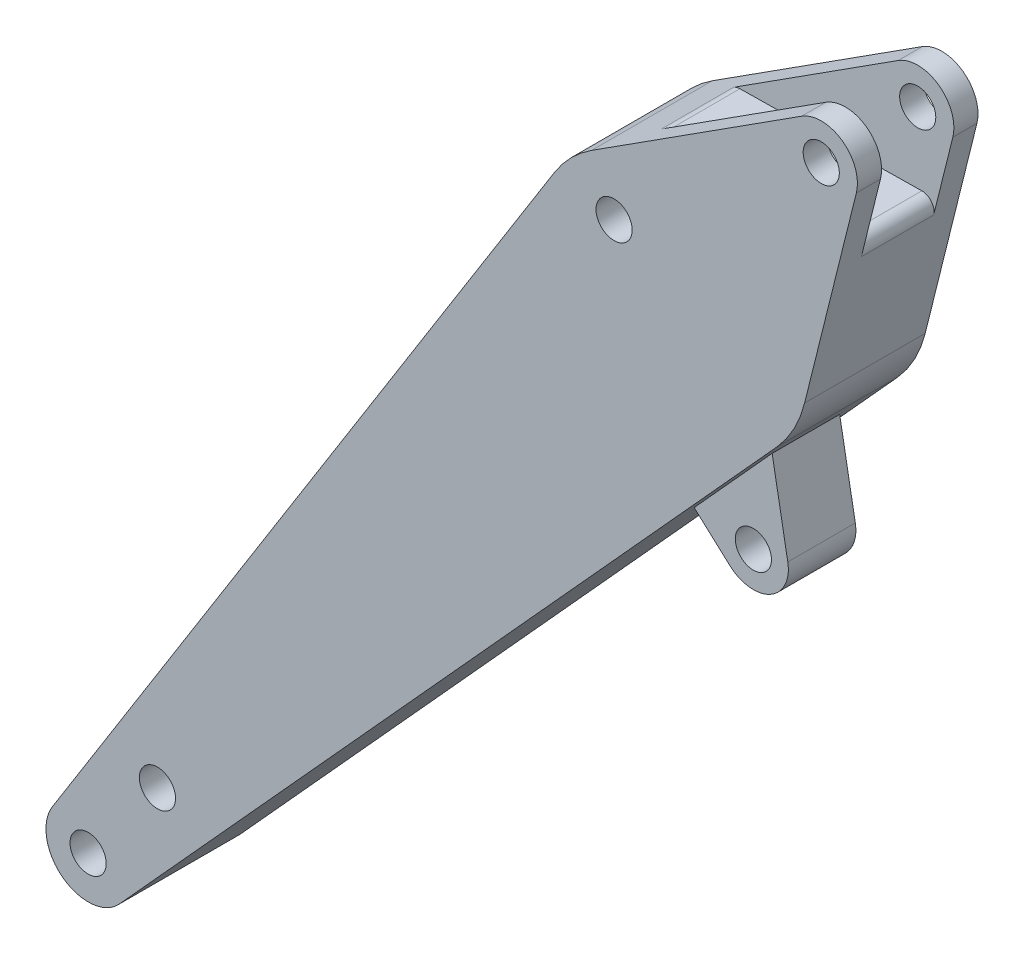
ISO-10303-21;
HEADER;
FILE_DESCRIPTION(('STEP AP214'),'2;1');
FILE_NAME('part.step','',(''),(''),'','','');
FILE_SCHEMA(('AUTOMOTIVE_DESIGN { 1 0 10303 214 1 1 1 1 }'));
ENDSEC;
DATA;
#1=APPLICATION_CONTEXT('core data for automotive mechanical design processes');
#2=APPLICATION_PROTOCOL_DEFINITION('international standard','automotive_design',2000,#1);
#3=PRODUCT_CONTEXT('',#1,'mechanical');
#4=PRODUCT('Part','Part','',(#3));
#5=PRODUCT_RELATED_PRODUCT_CATEGORY('part','',(#4));
#6=PRODUCT_DEFINITION_FORMATION('','',#4);
#7=PRODUCT_DEFINITION_CONTEXT('part definition',#1,'design');
#8=PRODUCT_DEFINITION('design','',#6,#7);
#9=PRODUCT_DEFINITION_SHAPE('','',#8);
#10=(LENGTH_UNIT() NAMED_UNIT(*) SI_UNIT(.MILLI.,.METRE.));
#11=(NAMED_UNIT(*) PLANE_ANGLE_UNIT() SI_UNIT($,.RADIAN.));
#12=(NAMED_UNIT(*) SI_UNIT($,.STERADIAN.) SOLID_ANGLE_UNIT());
#13=UNCERTAINTY_MEASURE_WITH_UNIT(LENGTH_MEASURE(1.E-05),#10,'distance_accuracy_value','');
#14=(GEOMETRIC_REPRESENTATION_CONTEXT(3) GLOBAL_UNCERTAINTY_ASSIGNED_CONTEXT((#13)) GLOBAL_UNIT_ASSIGNED_CONTEXT((#10,
#11,#12)) REPRESENTATION_CONTEXT('',''));
#15=CARTESIAN_POINT('',(0.,0.,0.));
#16=DIRECTION('',(0.,0.,1.));
#17=DIRECTION('',(1.,0.,0.));
#18=AXIS2_PLACEMENT_3D('',#15,#16,#17);
#19=CARTESIAN_POINT('',(255.314096956146,96.6057441759494,-5.));
#20=DIRECTION('',(0.740552858374982,-0.671998113057354,0.));
#21=DIRECTION('',(0.671998113057354,0.740552858374982,0.));
#22=AXIS2_PLACEMENT_3D('',#19,#20,#21);
#23=PLANE('',#22);
#24=DIRECTION('',(0.671998113057354,0.740552858374982,0.));
#25=VECTOR('',#24,1.);
#26=CARTESIAN_POINT('',(255.314096956146,96.6057441759494,-5.));
#27=LINE('',#26,#25);
#28=CARTESIAN_POINT('',(199.091935004312,34.6480066042993,-5.));
#29=VERTEX_POINT('',#28);
#30=CARTESIAN_POINT('',(253.623599132831,94.7427880592475,-5.));
#31=VERTEX_POINT('',#30);
#32=EDGE_CURVE('E282',#29,#31,#27,.T.);
#33=ORIENTED_EDGE('',*,*,#32,.T.);
#34=DIRECTION('',(0.,0.,1.));
#35=VECTOR('',#34,1.);
#36=CARTESIAN_POINT('',(253.623599132831,94.7427880592475,-5.));
#37=LINE('',#36,#35);
#38=CARTESIAN_POINT('',(253.623599132831,94.7427880592475,5.));
#39=VERTEX_POINT('',#38);
#40=EDGE_CURVE('E296',#31,#39,#37,.T.);
#41=ORIENTED_EDGE('',*,*,#40,.T.);
#42=DIRECTION('',(0.671998113057354,0.740552858374982,0.));
#43=VECTOR('',#42,1.);
#44=CARTESIAN_POINT('',(255.314096956146,96.6057441759494,5.));
#45=LINE('',#44,#43);
#46=CARTESIAN_POINT('',(199.091935004312,34.6480066042993,5.));
#47=VERTEX_POINT('',#46);
#48=EDGE_CURVE('E254',#47,#39,#45,.T.);
#49=ORIENTED_EDGE('',*,*,#48,.F.);
#50=DIRECTION('',(0.,0.,1.));
#51=VECTOR('',#50,1.);
#52=CARTESIAN_POINT('',(199.091935004312,34.6480066042993,-5.));
#53=LINE('',#52,#51);
#54=EDGE_CURVE('E295',#29,#47,#53,.T.);
#55=ORIENTED_EDGE('',*,*,#54,.F.);
#56=EDGE_LOOP('',(#33,#41,#49,#55));
#57=FACE_BOUND('',#56,.T.);
#58=DIRECTION('',(0.,0.,1.));
#59=VECTOR('',#58,1.);
#60=CARTESIAN_POINT('',(251.028481638349,91.8829263408655,-2.8));
#61=LINE('',#60,#59);
#62=CARTESIAN_POINT('',(251.028481638349,91.8829263408655,-2.8));
#63=VERTEX_POINT('',#62);
#64=CARTESIAN_POINT('',(251.028481638349,91.8829263408655,2.8));
#65=VERTEX_POINT('',#64);
#66=EDGE_CURVE('E209',#63,#65,#61,.T.);
#67=ORIENTED_EDGE('',*,*,#66,.F.);
#68=DIRECTION('',(-0.671998113057354,-0.740552858374982,0.));
#69=VECTOR('',#68,1.);
#70=CARTESIAN_POINT('',(244.56010576091,84.754670841326,-2.8));
#71=LINE('',#70,#69);
#72=CARTESIAN_POINT('',(244.56010576091,84.754670841326,-2.8));
#73=VERTEX_POINT('',#72);
#74=EDGE_CURVE('E171',#63,#73,#71,.T.);
#75=ORIENTED_EDGE('',*,*,#74,.T.);
#76=DIRECTION('',(0.,0.,1.));
#77=VECTOR('',#76,1.);
#78=CARTESIAN_POINT('',(244.56010576091,84.754670841326,-2.8));
#79=LINE('',#78,#77);
#80=CARTESIAN_POINT('',(244.56010576091,84.754670841326,2.8));
#81=VERTEX_POINT('',#80);
#82=EDGE_CURVE('E164',#73,#81,#79,.T.);
#83=ORIENTED_EDGE('',*,*,#82,.T.);
#84=DIRECTION('',(-0.671998113057354,-0.740552858374982,0.));
#85=VECTOR('',#84,1.);
#86=CARTESIAN_POINT('',(244.56010576091,84.754670841326,2.8));
#87=LINE('',#86,#85);
#88=EDGE_CURVE('E166',#65,#81,#87,.T.);
#89=ORIENTED_EDGE('',*,*,#88,.F.);
#90=EDGE_LOOP('',(#67,#75,#83,#89));
#91=FACE_BOUND('',#90,.T.);
#92=ADVANCED_FACE('F41',(#57,#91),#23,.T.);
#93=CARTESIAN_POINT('',(257.3,117.,-5.));
#94=DIRECTION('',(0.,0.,1.));
#95=DIRECTION('',(1.,0.,0.));
#96=AXIS2_PLACEMENT_3D('',#93,#94,#95);
#97=CYLINDRICAL_SURFACE('',#96,2.99999999999999);
#98=DIRECTION('',(0.,0.,1.));
#99=VECTOR('',#98,1.);
#100=CARTESIAN_POINT('',(255.681175991802,119.525749162225,-5.));
#101=LINE('',#100,#99);
#102=CARTESIAN_POINT('',(255.681175991802,119.525749162225,-5.));
#103=VERTEX_POINT('',#102);
#104=CARTESIAN_POINT('',(255.681175991802,119.525749162225,-3.));
#105=VERTEX_POINT('',#104);
#106=EDGE_CURVE('E299',#103,#105,#101,.T.);
#107=ORIENTED_EDGE('',*,*,#106,.T.);
#108=CARTESIAN_POINT('',(257.3,117.,-3.));
#109=DIRECTION('',(0.,0.,1.));
#110=DIRECTION('',(1.,0.,0.));
#111=AXIS2_PLACEMENT_3D('',#108,#109,#110);
#112=CIRCLE('',#111,2.99999999999999);
#113=CARTESIAN_POINT('',(260.211134206949,116.27522580818,-3.));
#114=VERTEX_POINT('',#113);
#115=EDGE_CURVE('E219',#114,#105,#112,.T.);
#116=ORIENTED_EDGE('',*,*,#115,.F.);
#117=DIRECTION('',(0.,0.,1.));
#118=VECTOR('',#117,1.);
#119=CARTESIAN_POINT('',(260.211134206949,116.27522580818,-5.));
#120=LINE('',#119,#118);
#121=CARTESIAN_POINT('',(260.211134206949,116.27522580818,-5.));
#122=VERTEX_POINT('',#121);
#123=EDGE_CURVE('E303',#122,#114,#120,.T.);
#124=ORIENTED_EDGE('',*,*,#123,.F.);
#125=CARTESIAN_POINT('',(257.3,117.,-5.));
#126=DIRECTION('',(0.,0.,1.));
#127=DIRECTION('',(-1.,0.,0.));
#128=AXIS2_PLACEMENT_3D('',#125,#126,#127);
#129=CIRCLE('',#128,2.99999999999999);
#130=EDGE_CURVE('E287',#122,#103,#129,.T.);
#131=ORIENTED_EDGE('',*,*,#130,.T.);
#132=EDGE_LOOP('',(#107,#116,#124,#131));
#133=FACE_BOUND('',#132,.T.);
#134=ADVANCED_FACE('F360',(#133),#97,.T.);
#135=CARTESIAN_POINT('',(257.3,117.,-5.));
#136=DIRECTION('',(0.,0.,1.));
#137=DIRECTION('',(1.,0.,0.));
#138=AXIS2_PLACEMENT_3D('',#135,#136,#137);
#139=CYLINDRICAL_SURFACE('',#138,1.50000000000002);
#140=CARTESIAN_POINT('',(257.3,117.,-5.));
#141=DIRECTION('',(0.,0.,1.));
#142=DIRECTION('',(1.,0.,0.));
#143=AXIS2_PLACEMENT_3D('',#140,#141,#142);
#144=CIRCLE('',#143,1.50000000000002);
#145=CARTESIAN_POINT('',(258.8,117.,-5.));
#146=VERTEX_POINT('',#145);
#147=EDGE_CURVE('E269',#146,#146,#144,.T.);
#148=ORIENTED_EDGE('',*,*,#147,.F.);
#149=EDGE_LOOP('',(#148));
#150=FACE_BOUND('',#149,.T.);
#151=CARTESIAN_POINT('',(257.3,117.,-3.));
#152=DIRECTION('',(0.,0.,1.));
#153=DIRECTION('',(1.,0.,0.));
#154=AXIS2_PLACEMENT_3D('',#151,#152,#153);
#155=CIRCLE('',#154,1.50000000000002);
#156=CARTESIAN_POINT('',(258.8,117.,-3.));
#157=VERTEX_POINT('',#156);
#158=EDGE_CURVE('E212',#157,#157,#155,.T.);
#159=ORIENTED_EDGE('',*,*,#158,.T.);
#160=EDGE_LOOP('',(#159));
#161=FACE_BOUND('',#160,.T.);
#162=ADVANCED_FACE('F408',(#150,#161),#139,.F.);
#163=CARTESIAN_POINT('',(196.5,37.,-5.));
#164=DIRECTION('',(0.,0.,1.));
#165=DIRECTION('',(1.,0.,0.));
#166=AXIS2_PLACEMENT_3D('',#163,#164,#165);
#167=CYLINDRICAL_SURFACE('',#166,3.50000000000002);
#168=ORIENTED_EDGE('',*,*,#54,.T.);
#169=CARTESIAN_POINT('',(196.5,37.,5.));
#170=DIRECTION('',(0.,0.,1.));
#171=DIRECTION('',(1.,0.,0.));
#172=AXIS2_PLACEMENT_3D('',#169,#170,#171);
#173=CIRCLE('',#172,3.50000000000002);
#174=CARTESIAN_POINT('',(193.535103741344,38.8599435946842,5.));
#175=VERTEX_POINT('',#174);
#176=EDGE_CURVE('E249',#175,#47,#173,.T.);
#177=ORIENTED_EDGE('',*,*,#176,.F.);
#178=DIRECTION('',(0.,0.,1.));
#179=VECTOR('',#178,1.);
#180=CARTESIAN_POINT('',(193.535103741344,38.8599435946842,-5.));
#181=LINE('',#180,#179);
#182=CARTESIAN_POINT('',(193.535103741344,38.8599435946842,-5.));
#183=VERTEX_POINT('',#182);
#184=EDGE_CURVE('E294',#183,#175,#181,.T.);
#185=ORIENTED_EDGE('',*,*,#184,.F.);
#186=CARTESIAN_POINT('',(196.5,37.,-5.));
#187=DIRECTION('',(0.,0.,1.));
#188=DIRECTION('',(1.,0.,0.));
#189=AXIS2_PLACEMENT_3D('',#186,#187,#188);
#190=CIRCLE('',#189,3.50000000000002);
#191=EDGE_CURVE('E279',#183,#29,#190,.T.);
#192=ORIENTED_EDGE('',*,*,#191,.T.);
#193=EDGE_LOOP('',(#168,#177,#185,#192));
#194=FACE_BOUND('',#193,.T.);
#195=ADVANCED_FACE('F385',(#194),#167,.T.);
#196=CARTESIAN_POINT('',(236.376857538445,107.153065983085,-5.));
#197=DIRECTION('',(-0.847113216758896,0.531412455624063,0.));
#198=DIRECTION('',(-0.531412455624063,-0.847113216758896,0.));
#199=AXIS2_PLACEMENT_3D('',#196,#197,#198);
#200=PLANE('',#199);
#201=DIRECTION('',(-0.531412455624063,-0.847113216758896,0.));
#202=VECTOR('',#201,1.);
#203=CARTESIAN_POINT('',(236.376857538445,107.153065983085,5.));
#204=LINE('',#203,#202);
#205=CARTESIAN_POINT('',(235.186959709298,105.256275332066,5.));
#206=VERTEX_POINT('',#205);
#207=EDGE_CURVE('E264',#206,#175,#204,.T.);
#208=ORIENTED_EDGE('',*,*,#207,.F.);
#209=DIRECTION('',(0.,0.,1.));
#210=VECTOR('',#209,1.);
#211=CARTESIAN_POINT('',(235.186959709298,105.256275332066,-5.));
#212=LINE('',#211,#210);
#213=CARTESIAN_POINT('',(235.186959709298,105.256275332066,-5.));
#214=VERTEX_POINT('',#213);
#215=EDGE_CURVE('E324',#206,#214,#212,.F.);
#216=ORIENTED_EDGE('',*,*,#215,.T.);
#217=DIRECTION('',(-0.531412455624063,-0.847113216758896,0.));
#218=VECTOR('',#217,1.);
#219=CARTESIAN_POINT('',(236.376857538445,107.153065983085,-5.));
#220=LINE('',#219,#218);
#221=EDGE_CURVE('E292',#214,#183,#220,.T.);
#222=ORIENTED_EDGE('',*,*,#221,.T.);
#223=ORIENTED_EDGE('',*,*,#184,.T.);
#224=EDGE_LOOP('',(#208,#216,#222,#223));
#225=FACE_BOUND('',#224,.T.);
#226=ADVANCED_FACE('F410',(#225),#200,.T.);
#227=CARTESIAN_POINT('',(255.681175991802,119.525749162225,-5.));
#228=DIRECTION('',(-0.539608002732634,0.841916387408452,0.));
#229=DIRECTION('',(-0.841916387408452,-0.539608002732634,0.));
#230=AXIS2_PLACEMENT_3D('',#227,#228,#229);
#231=PLANE('',#230);
#232=DIRECTION('',(0.,0.,-1.));
#233=VECTOR('',#232,1.);
#234=CARTESIAN_POINT('',(242.029948589733,110.776291777325,-5.));
#235=LINE('',#234,#233);
#236=CARTESIAN_POINT('',(242.029948589733,110.776291777325,3.));
#237=VERTEX_POINT('',#236);
#238=CARTESIAN_POINT('',(242.029948589733,110.776291777325,-3.));
#239=VERTEX_POINT('',#238);
#240=EDGE_CURVE('E333',#237,#239,#235,.T.);
#241=ORIENTED_EDGE('',*,*,#240,.T.);
#242=DIRECTION('',(-0.841916387408452,-0.539608002732634,0.));
#243=VECTOR('',#242,1.);
#244=CARTESIAN_POINT('',(20.1473017879034,-31.4345662988694,-3.));
#245=LINE('',#244,#243);
#246=EDGE_CURVE('E57',#105,#239,#245,.T.);
#247=ORIENTED_EDGE('',*,*,#246,.F.);
#248=ORIENTED_EDGE('',*,*,#106,.F.);
#249=DIRECTION('',(-0.841916387408452,-0.539608002732634,0.));
#250=VECTOR('',#249,1.);
#251=CARTESIAN_POINT('',(255.681175991802,119.525749162225,-5.));
#252=LINE('',#251,#250);
#253=CARTESIAN_POINT('',(238.262011849561,108.36131464991,-5.));
#254=VERTEX_POINT('',#253);
#255=EDGE_CURVE('E289',#103,#254,#252,.T.);
#256=ORIENTED_EDGE('',*,*,#255,.T.);
#257=DIRECTION('',(0.,0.,1.));
#258=VECTOR('',#257,1.);
#259=CARTESIAN_POINT('',(238.262011849561,108.36131464991,-5.));
#260=LINE('',#259,#258);
#261=CARTESIAN_POINT('',(238.262011849561,108.36131464991,5.));
#262=VERTEX_POINT('',#261);
#263=EDGE_CURVE('E318',#254,#262,#260,.T.);
#264=ORIENTED_EDGE('',*,*,#263,.T.);
#265=DIRECTION('',(-0.841916387408452,-0.539608002732634,0.));
#266=VECTOR('',#265,1.);
#267=CARTESIAN_POINT('',(255.681175991802,119.525749162225,5.));
#268=LINE('',#267,#266);
#269=CARTESIAN_POINT('',(255.681175991802,119.525749162225,5.));
#270=VERTEX_POINT('',#269);
#271=EDGE_CURVE('E262',#270,#262,#268,.T.);
#272=ORIENTED_EDGE('',*,*,#271,.F.);
#273=CARTESIAN_POINT('',(255.681175991802,119.525749162225,3.));
#274=VERTEX_POINT('',#273);
#275=EDGE_CURVE('E305',#274,#270,#101,.T.);
#276=ORIENTED_EDGE('',*,*,#275,.F.);
#277=DIRECTION('',(-0.841916387408452,-0.539608002732634,0.));
#278=VECTOR('',#277,1.);
#279=CARTESIAN_POINT('',(20.1473017879034,-31.4345662988694,3.));
#280=LINE('',#279,#278);
#281=EDGE_CURVE('E61',#274,#237,#280,.T.);
#282=ORIENTED_EDGE('',*,*,#281,.T.);
#283=EDGE_LOOP('',(#241,#247,#248,#256,#264,#272,#276,#282));
#284=FACE_BOUND('',#283,.T.);
#285=ADVANCED_FACE('F395',(#284),#231,.T.);
#286=CARTESIAN_POINT('',(257.3,117.,3.));
#287=DIRECTION('',(0.,0.,1.));
#288=DIRECTION('',(1.,0.,0.));
#289=AXIS2_PLACEMENT_3D('',#286,#287,#288);
#290=CIRCLE('',#289,2.99999999999999);
#291=CARTESIAN_POINT('',(260.211134206949,116.27522580818,3.));
#292=VERTEX_POINT('',#291);
#293=EDGE_CURVE('E233',#292,#274,#290,.T.);
#294=ORIENTED_EDGE('',*,*,#293,.T.);
#295=ORIENTED_EDGE('',*,*,#275,.T.);
#296=CARTESIAN_POINT('',(257.3,117.,5.));
#297=DIRECTION('',(0.,0.,1.));
#298=DIRECTION('',(-1.,0.,0.));
#299=AXIS2_PLACEMENT_3D('',#296,#297,#298);
#300=CIRCLE('',#299,2.99999999999999);
#301=CARTESIAN_POINT('',(260.211134206949,116.27522580818,5.));
#302=VERTEX_POINT('',#301);
#303=EDGE_CURVE('E259',#302,#270,#300,.T.);
#304=ORIENTED_EDGE('',*,*,#303,.F.);
#305=EDGE_CURVE('E306',#292,#302,#120,.T.);
#306=ORIENTED_EDGE('',*,*,#305,.F.);
#307=EDGE_LOOP('',(#294,#295,#304,#306));
#308=FACE_BOUND('',#307,.T.);
#309=ADVANCED_FACE('F400',(#308),#97,.T.);
#310=CARTESIAN_POINT('',(255.314096956146,96.6057441759494,-5.));
#311=DIRECTION('',(0.97037806898317,-0.241591397273358,0.));
#312=DIRECTION('',(0.241591397273358,0.97037806898317,0.));
#313=AXIS2_PLACEMENT_3D('',#310,#311,#312);
#314=PLANE('',#313);
#315=DIRECTION('',(0.241591397273358,0.97037806898317,0.));
#316=VECTOR('',#315,1.);
#317=CARTESIAN_POINT('',(217.764564406619,-54.2160288584713,-3.));
#318=LINE('',#317,#316);
#319=CARTESIAN_POINT('',(258.624397622815,109.90192609687,-3.));
#320=VERTEX_POINT('',#319);
#321=EDGE_CURVE('E220',#320,#114,#318,.T.);
#322=ORIENTED_EDGE('',*,*,#321,.F.);
#323=DIRECTION('',(0.,0.,-1.));
#324=VECTOR('',#323,1.);
#325=CARTESIAN_POINT('',(258.624397622815,109.90192609687,-5.));
#326=LINE('',#325,#324);
#327=CARTESIAN_POINT('',(258.624397622815,109.901926096871,3.));
#328=VERTEX_POINT('',#327);
#329=EDGE_CURVE('E326',#320,#328,#326,.F.);
#330=ORIENTED_EDGE('',*,*,#329,.T.);
#331=DIRECTION('',(0.241591397273358,0.97037806898317,0.));
#332=VECTOR('',#331,1.);
#333=CARTESIAN_POINT('',(217.764564406619,-54.2160288584713,3.));
#334=LINE('',#333,#332);
#335=EDGE_CURVE('E226',#328,#292,#334,.T.);
#336=ORIENTED_EDGE('',*,*,#335,.T.);
#337=ORIENTED_EDGE('',*,*,#305,.T.);
#338=DIRECTION('',(0.241591397273358,0.97037806898317,0.));
#339=VECTOR('',#338,1.);
#340=CARTESIAN_POINT('',(255.314096956146,96.6057441759494,5.));
#341=LINE('',#340,#339);
#342=CARTESIAN_POINT('',(255.921851238913,99.0468552170875,5.));
#343=VERTEX_POINT('',#342);
#344=EDGE_CURVE('E257',#343,#302,#341,.T.);
#345=ORIENTED_EDGE('',*,*,#344,.F.);
#346=DIRECTION('',(0.,0.,1.));
#347=VECTOR('',#346,1.);
#348=CARTESIAN_POINT('',(255.921851238913,99.0468552170875,-5.));
#349=LINE('',#348,#347);
#350=CARTESIAN_POINT('',(255.921851238913,99.0468552170875,-5.));
#351=VERTEX_POINT('',#350);
#352=EDGE_CURVE('E313',#343,#351,#349,.F.);
#353=ORIENTED_EDGE('',*,*,#352,.T.);
#354=DIRECTION('',(0.241591397273358,0.97037806898317,0.));
#355=VECTOR('',#354,1.);
#356=CARTESIAN_POINT('',(255.314096956146,96.6057441759494,-5.));
#357=LINE('',#356,#355);
#358=EDGE_CURVE('E284',#351,#122,#357,.T.);
#359=ORIENTED_EDGE('',*,*,#358,.T.);
#360=ORIENTED_EDGE('',*,*,#123,.T.);
#361=EDGE_LOOP('',(#322,#330,#336,#337,#345,#353,#359,#360));
#362=FACE_BOUND('',#361,.T.);
#363=ADVANCED_FACE('F363',(#362),#314,.T.);
#364=CARTESIAN_POINT('',(196.5,37.,-5.));
#365=DIRECTION('',(0.,0.,1.));
#366=DIRECTION('',(1.,0.,0.));
#367=AXIS2_PLACEMENT_3D('',#364,#365,#366);
#368=PLANE('',#367);
#369=CARTESIAN_POINT('',(240.118819850824,104.309174625678,-5.));
#370=DIRECTION('',(0.,0.,1.));
#371=DIRECTION('',(1.,0.,0.));
#372=AXIS2_PLACEMENT_3D('',#369,#370,#371);
#373=CIRCLE('',#372,1.49999999999999);
#374=CARTESIAN_POINT('',(241.618819850824,104.309174625678,-5.));
#375=VERTEX_POINT('',#374);
#376=EDGE_CURVE('E267',#375,#375,#373,.T.);
#377=ORIENTED_EDGE('',*,*,#376,.T.);
#378=EDGE_LOOP('',(#377));
#379=FACE_BOUND('',#378,.T.);
#380=ORIENTED_EDGE('',*,*,#147,.T.);
#381=EDGE_LOOP('',(#380));
#382=FACE_BOUND('',#381,.T.);
#383=CARTESIAN_POINT('',(202.248291041569,44.5635408441695,-5.));
#384=DIRECTION('',(0.,0.,1.));
#385=DIRECTION('',(1.,0.,0.));
#386=AXIS2_PLACEMENT_3D('',#383,#384,#385);
#387=CIRCLE('',#386,1.5);
#388=CARTESIAN_POINT('',(203.748291041569,44.5635408441695,-5.));
#389=VERTEX_POINT('',#388);
#390=EDGE_CURVE('E275',#389,#389,#387,.T.);
#391=ORIENTED_EDGE('',*,*,#390,.T.);
#392=EDGE_LOOP('',(#391));
#393=FACE_BOUND('',#392,.T.);
#394=CARTESIAN_POINT('',(196.5,37.,-5.));
#395=DIRECTION('',(0.,0.,1.));
#396=DIRECTION('',(1.,0.,0.));
#397=AXIS2_PLACEMENT_3D('',#394,#395,#396);
#398=CIRCLE('',#397,1.5);
#399=CARTESIAN_POINT('',(198.,37.,-5.));
#400=VERTEX_POINT('',#399);
#401=EDGE_CURVE('E273',#400,#400,#398,.T.);
#402=ORIENTED_EDGE('',*,*,#401,.T.);
#403=EDGE_LOOP('',(#402));
#404=FACE_BOUND('',#403,.T.);
#405=ORIENTED_EDGE('',*,*,#358,.F.);
#406=CARTESIAN_POINT('',(246.218070549082,101.462769189821,-5.));
#407=DIRECTION('',(0.,0.,1.));
#408=DIRECTION('',(1.,0.,0.));
#409=AXIS2_PLACEMENT_3D('',#406,#407,#408);
#410=CIRCLE('',#409,10.);
#411=EDGE_CURVE('E319',#351,#31,#410,.F.);
#412=ORIENTED_EDGE('',*,*,#411,.T.);
#413=ORIENTED_EDGE('',*,*,#32,.F.);
#414=ORIENTED_EDGE('',*,*,#191,.F.);
#415=ORIENTED_EDGE('',*,*,#221,.F.);
#416=CARTESIAN_POINT('',(243.658091876887,99.9421507758256,-5.));
#417=DIRECTION('',(0.,0.,1.));
#418=DIRECTION('',(1.,0.,0.));
#419=AXIS2_PLACEMENT_3D('',#416,#417,#418);
#420=CIRCLE('',#419,10.);
#421=EDGE_CURVE('E317',#214,#254,#420,.F.);
#422=ORIENTED_EDGE('',*,*,#421,.T.);
#423=ORIENTED_EDGE('',*,*,#255,.F.);
#424=ORIENTED_EDGE('',*,*,#130,.F.);
#425=EDGE_LOOP('',(#405,#412,#413,#414,#415,#422,#423,#424));
#426=FACE_BOUND('',#425,.T.);
#427=ADVANCED_FACE('F370',(#379,#382,#393,#404,#426),#368,.F.);
#428=CARTESIAN_POINT('',(196.5,37.,-5.));
#429=DIRECTION('',(0.,0.,1.));
#430=DIRECTION('',(1.,0.,0.));
#431=AXIS2_PLACEMENT_3D('',#428,#429,#430);
#432=CYLINDRICAL_SURFACE('',#431,1.5);
#433=ORIENTED_EDGE('',*,*,#401,.F.);
#434=EDGE_LOOP('',(#433));
#435=FACE_BOUND('',#434,.T.);
#436=CARTESIAN_POINT('',(196.5,37.,5.));
#437=DIRECTION('',(0.,0.,1.));
#438=DIRECTION('',(1.,0.,0.));
#439=AXIS2_PLACEMENT_3D('',#436,#437,#438);
#440=CIRCLE('',#439,1.5);
#441=CARTESIAN_POINT('',(198.,37.,5.));
#442=VERTEX_POINT('',#441);
#443=EDGE_CURVE('E250',#442,#442,#440,.T.);
#444=ORIENTED_EDGE('',*,*,#443,.T.);
#445=EDGE_LOOP('',(#444));
#446=FACE_BOUND('',#445,.T.);
#447=ADVANCED_FACE('F544',(#435,#446),#432,.F.);
#448=CARTESIAN_POINT('',(202.248291041569,44.5635408441695,-5.));
#449=DIRECTION('',(0.,0.,1.));
#450=DIRECTION('',(1.,0.,0.));
#451=AXIS2_PLACEMENT_3D('',#448,#449,#450);
#452=CYLINDRICAL_SURFACE('',#451,1.5);
#453=ORIENTED_EDGE('',*,*,#390,.F.);
#454=EDGE_LOOP('',(#453));
#455=FACE_BOUND('',#454,.T.);
#456=CARTESIAN_POINT('',(202.248291041569,44.5635408441695,5.));
#457=DIRECTION('',(0.,0.,1.));
#458=DIRECTION('',(1.,0.,0.));
#459=AXIS2_PLACEMENT_3D('',#456,#457,#458);
#460=CIRCLE('',#459,1.5);
#461=CARTESIAN_POINT('',(203.748291041569,44.5635408441695,5.));
#462=VERTEX_POINT('',#461);
#463=EDGE_CURVE('E242',#462,#462,#460,.T.);
#464=ORIENTED_EDGE('',*,*,#463,.T.);
#465=EDGE_LOOP('',(#464));
#466=FACE_BOUND('',#465,.T.);
#467=ADVANCED_FACE('F539',(#455,#466),#452,.F.);
#468=CARTESIAN_POINT('',(257.3,117.,3.));
#469=DIRECTION('',(0.,0.,1.));
#470=DIRECTION('',(1.,0.,0.));
#471=AXIS2_PLACEMENT_3D('',#468,#469,#470);
#472=CIRCLE('',#471,1.50000000000002);
#473=CARTESIAN_POINT('',(258.8,117.,3.));
#474=VERTEX_POINT('',#473);
#475=EDGE_CURVE('E221',#474,#474,#472,.T.);
#476=ORIENTED_EDGE('',*,*,#475,.F.);
#477=EDGE_LOOP('',(#476));
#478=FACE_BOUND('',#477,.T.);
#479=CARTESIAN_POINT('',(257.3,117.,5.));
#480=DIRECTION('',(0.,0.,1.));
#481=DIRECTION('',(1.,0.,0.));
#482=AXIS2_PLACEMENT_3D('',#479,#480,#481);
#483=CIRCLE('',#482,1.50000000000002);
#484=CARTESIAN_POINT('',(258.8,117.,5.));
#485=VERTEX_POINT('',#484);
#486=EDGE_CURVE('E241',#485,#485,#483,.T.);
#487=ORIENTED_EDGE('',*,*,#486,.T.);
#488=EDGE_LOOP('',(#487));
#489=FACE_BOUND('',#488,.T.);
#490=ADVANCED_FACE('F519',(#478,#489),#139,.F.);
#491=CARTESIAN_POINT('',(240.118819850824,104.309174625678,-5.));
#492=DIRECTION('',(0.,0.,1.));
#493=DIRECTION('',(1.,0.,0.));
#494=AXIS2_PLACEMENT_3D('',#491,#492,#493);
#495=CYLINDRICAL_SURFACE('',#494,1.49999999999999);
#496=ORIENTED_EDGE('',*,*,#376,.F.);
#497=EDGE_LOOP('',(#496));
#498=FACE_BOUND('',#497,.T.);
#499=CARTESIAN_POINT('',(240.118819850824,104.309174625678,5.));
#500=DIRECTION('',(0.,0.,1.));
#501=DIRECTION('',(1.,0.,0.));
#502=AXIS2_PLACEMENT_3D('',#499,#500,#501);
#503=CIRCLE('',#502,1.49999999999999);
#504=CARTESIAN_POINT('',(241.618819850824,104.309174625678,5.));
#505=VERTEX_POINT('',#504);
#506=EDGE_CURVE('E238',#505,#505,#503,.T.);
#507=ORIENTED_EDGE('',*,*,#506,.T.);
#508=EDGE_LOOP('',(#507));
#509=FACE_BOUND('',#508,.T.);
#510=ADVANCED_FACE('F523',(#498,#509),#495,.F.);
#511=CARTESIAN_POINT('',(196.5,37.,5.));
#512=DIRECTION('',(0.,0.,1.));
#513=DIRECTION('',(1.,0.,0.));
#514=AXIS2_PLACEMENT_3D('',#511,#512,#513);
#515=PLANE('',#514);
#516=ORIENTED_EDGE('',*,*,#486,.F.);
#517=EDGE_LOOP('',(#516));
#518=FACE_BOUND('',#517,.T.);
#519=ORIENTED_EDGE('',*,*,#443,.F.);
#520=EDGE_LOOP('',(#519));
#521=FACE_BOUND('',#520,.T.);
#522=ORIENTED_EDGE('',*,*,#48,.T.);
#523=CARTESIAN_POINT('',(246.218070549082,101.462769189821,5.));
#524=DIRECTION('',(0.,0.,1.));
#525=DIRECTION('',(1.,0.,0.));
#526=AXIS2_PLACEMENT_3D('',#523,#524,#525);
#527=CIRCLE('',#526,10.);
#528=EDGE_CURVE('E315',#39,#343,#527,.T.);
#529=ORIENTED_EDGE('',*,*,#528,.T.);
#530=ORIENTED_EDGE('',*,*,#344,.T.);
#531=ORIENTED_EDGE('',*,*,#303,.T.);
#532=ORIENTED_EDGE('',*,*,#271,.T.);
#533=CARTESIAN_POINT('',(243.658091876887,99.9421507758256,5.));
#534=DIRECTION('',(0.,0.,1.));
#535=DIRECTION('',(1.,0.,0.));
#536=AXIS2_PLACEMENT_3D('',#533,#534,#535);
#537=CIRCLE('',#536,10.);
#538=EDGE_CURVE('E309',#262,#206,#537,.T.);
#539=ORIENTED_EDGE('',*,*,#538,.T.);
#540=ORIENTED_EDGE('',*,*,#207,.T.);
#541=ORIENTED_EDGE('',*,*,#176,.T.);
#542=EDGE_LOOP('',(#522,#529,#530,#531,#532,#539,#540,#541));
#543=FACE_BOUND('',#542,.T.);
#544=ORIENTED_EDGE('',*,*,#463,.F.);
#545=EDGE_LOOP('',(#544));
#546=FACE_BOUND('',#545,.T.);
#547=ORIENTED_EDGE('',*,*,#506,.F.);
#548=EDGE_LOOP('',(#547));
#549=FACE_BOUND('',#548,.T.);
#550=ADVANCED_FACE('F376',(#518,#521,#543,#546,#549),#515,.T.);
#551=CARTESIAN_POINT('',(-1.49116120040864,107.550633958171,3.));
#552=DIRECTION('',(-0.0138634040781688,0.999903898395923,0.));
#553=DIRECTION('',(-0.999903898395924,-0.0138634040781688,0.));
#554=AXIS2_PLACEMENT_3D('',#551,#552,#553);
#555=PLANE('',#554);
#556=DIRECTION('',(0.999903898395924,0.0138634040781688,0.));
#557=VECTOR('',#556,1.);
#558=CARTESIAN_POINT('',(-1.49116120040864,107.550633958171,3.));
#559=LINE('',#558,#557);
#560=CARTESIAN_POINT('',(242.555693188387,110.934279288312,3.));
#561=VERTEX_POINT('',#560);
#562=CARTESIAN_POINT('',(257.640156149754,111.14342139254,3.));
#563=VERTEX_POINT('',#562);
#564=EDGE_CURVE('E232',#561,#563,#559,.T.);
#565=ORIENTED_EDGE('',*,*,#564,.T.);
#566=DIRECTION('',(0.,0.,-1.));
#567=VECTOR('',#566,1.);
#568=CARTESIAN_POINT('',(257.640156149754,111.14342139254,3.));
#569=LINE('',#568,#567);
#570=CARTESIAN_POINT('',(257.640156149754,111.14342139254,-3.));
#571=VERTEX_POINT('',#570);
#572=EDGE_CURVE('E330',#563,#571,#569,.T.);
#573=ORIENTED_EDGE('',*,*,#572,.T.);
#574=DIRECTION('',(0.999903898395924,0.0138634040781688,0.));
#575=VECTOR('',#574,1.);
#576=CARTESIAN_POINT('',(-1.49116120040864,107.550633958171,-3.));
#577=LINE('',#576,#575);
#578=CARTESIAN_POINT('',(242.555693188387,110.934279288312,-3.));
#579=VERTEX_POINT('',#578);
#580=EDGE_CURVE('E225',#579,#571,#577,.T.);
#581=ORIENTED_EDGE('',*,*,#580,.F.);
#582=DIRECTION('',(0.,0.,-1.));
#583=VECTOR('',#582,1.);
#584=CARTESIAN_POINT('',(242.555693188387,110.934279288312,3.));
#585=LINE('',#584,#583);
#586=EDGE_CURVE('E323',#579,#561,#585,.F.);
#587=ORIENTED_EDGE('',*,*,#586,.T.);
#588=EDGE_LOOP('',(#565,#573,#581,#587));
#589=FACE_BOUND('',#588,.T.);
#590=ADVANCED_FACE('F343',(#589),#555,.T.);
#591=CARTESIAN_POINT('',(0.,0.,3.));
#592=DIRECTION('',(0.,0.,1.));
#593=DIRECTION('',(1.,0.,0.));
#594=AXIS2_PLACEMENT_3D('',#591,#592,#593);
#595=PLANE('',#594);
#596=ORIENTED_EDGE('',*,*,#475,.T.);
#597=EDGE_LOOP('',(#596));
#598=FACE_BOUND('',#597,.T.);
#599=ORIENTED_EDGE('',*,*,#335,.F.);
#600=CARTESIAN_POINT('',(257.654019553832,110.143517494144,3.));
#601=DIRECTION('',(0.,0.,1.));
#602=DIRECTION('',(1.,0.,0.));
#603=AXIS2_PLACEMENT_3D('',#600,#601,#602);
#604=CIRCLE('',#603,1.);
#605=EDGE_CURVE('E336',#328,#563,#604,.T.);
#606=ORIENTED_EDGE('',*,*,#605,.T.);
#607=ORIENTED_EDGE('',*,*,#564,.F.);
#608=CARTESIAN_POINT('',(242.569556592466,109.934375389917,3.));
#609=DIRECTION('',(0.,0.,1.));
#610=DIRECTION('',(1.,0.,0.));
#611=AXIS2_PLACEMENT_3D('',#608,#609,#610);
#612=CIRCLE('',#611,1.);
#613=EDGE_CURVE('E11',#561,#237,#612,.T.);
#614=ORIENTED_EDGE('',*,*,#613,.T.);
#615=ORIENTED_EDGE('',*,*,#281,.F.);
#616=ORIENTED_EDGE('',*,*,#293,.F.);
#617=EDGE_LOOP('',(#599,#606,#607,#614,#615,#616));
#618=FACE_BOUND('',#617,.T.);
#619=ADVANCED_FACE('F346',(#598,#618),#595,.F.);
#620=CARTESIAN_POINT('',(0.,0.,-3.));
#621=DIRECTION('',(0.,0.,1.));
#622=DIRECTION('',(1.,0.,0.));
#623=AXIS2_PLACEMENT_3D('',#620,#621,#622);
#624=PLANE('',#623);
#625=ORIENTED_EDGE('',*,*,#158,.F.);
#626=EDGE_LOOP('',(#625));
#627=FACE_BOUND('',#626,.T.);
#628=ORIENTED_EDGE('',*,*,#321,.T.);
#629=ORIENTED_EDGE('',*,*,#115,.T.);
#630=ORIENTED_EDGE('',*,*,#246,.T.);
#631=CARTESIAN_POINT('',(242.569556592466,109.934375389917,-3.));
#632=DIRECTION('',(0.,0.,1.));
#633=DIRECTION('',(1.,0.,0.));
#634=AXIS2_PLACEMENT_3D('',#631,#632,#633);
#635=CIRCLE('',#634,1.);
#636=EDGE_CURVE('E47',#239,#579,#635,.F.);
#637=ORIENTED_EDGE('',*,*,#636,.T.);
#638=ORIENTED_EDGE('',*,*,#580,.T.);
#639=CARTESIAN_POINT('',(257.654019553832,110.143517494144,-3.));
#640=DIRECTION('',(0.,0.,1.));
#641=DIRECTION('',(1.,0.,0.));
#642=AXIS2_PLACEMENT_3D('',#639,#640,#641);
#643=CIRCLE('',#642,1.);
#644=EDGE_CURVE('E331',#571,#320,#643,.F.);
#645=ORIENTED_EDGE('',*,*,#644,.T.);
#646=EDGE_LOOP('',(#628,#629,#630,#637,#638,#645));
#647=FACE_BOUND('',#646,.T.);
#648=ADVANCED_FACE('F338',(#627,#647),#624,.T.);
#649=CARTESIAN_POINT('',(251.028481638349,91.8829263408655,-2.8));
#650=DIRECTION('',(0.983969653040116,0.178335980374446,0.));
#651=DIRECTION('',(-0.178335980374446,0.983969653040116,0.));
#652=AXIS2_PLACEMENT_3D('',#649,#650,#651);
#653=PLANE('',#652);
#654=ORIENTED_EDGE('',*,*,#66,.T.);
#655=DIRECTION('',(-0.178335980374446,0.983969653040115,0.));
#656=VECTOR('',#655,1.);
#657=CARTESIAN_POINT('',(251.028481638349,91.8829263408655,2.8));
#658=LINE('',#657,#656);
#659=CARTESIAN_POINT('',(252.324623716093,84.7314560214699,2.8));
#660=VERTEX_POINT('',#659);
#661=EDGE_CURVE('E188',#660,#65,#658,.T.);
#662=ORIENTED_EDGE('',*,*,#661,.F.);
#663=DIRECTION('',(0.,0.,1.));
#664=VECTOR('',#663,1.);
#665=CARTESIAN_POINT('',(252.324623716093,84.7314560214699,-2.8));
#666=LINE('',#665,#664);
#667=CARTESIAN_POINT('',(252.324623716093,84.7314560214699,-2.8));
#668=VERTEX_POINT('',#667);
#669=EDGE_CURVE('E215',#668,#660,#666,.T.);
#670=ORIENTED_EDGE('',*,*,#669,.F.);
#671=DIRECTION('',(-0.178335980374446,0.983969653040115,0.));
#672=VECTOR('',#671,1.);
#673=CARTESIAN_POINT('',(251.028481638349,91.8829263408655,-2.8));
#674=LINE('',#673,#672);
#675=EDGE_CURVE('E176',#668,#63,#674,.T.);
#676=ORIENTED_EDGE('',*,*,#675,.T.);
#677=EDGE_LOOP('',(#654,#662,#670,#676));
#678=FACE_BOUND('',#677,.T.);
#679=ADVANCED_FACE('F477',(#678),#653,.T.);
#680=CARTESIAN_POINT('',(249.471111722277,84.2142816783841,-2.8));
#681=DIRECTION('',(0.,0.,1.));
#682=DIRECTION('',(1.,0.,0.));
#683=AXIS2_PLACEMENT_3D('',#680,#681,#682);
#684=CYLINDRICAL_SURFACE('',#683,2.90000000000006);
#685=ORIENTED_EDGE('',*,*,#669,.T.);
#686=CARTESIAN_POINT('',(249.471111722277,84.2142816783841,2.8));
#687=DIRECTION('',(0.,0.,1.));
#688=DIRECTION('',(1.,0.,0.));
#689=AXIS2_PLACEMENT_3D('',#686,#687,#688);
#690=CIRCLE('',#689,2.90000000000006);
#691=CARTESIAN_POINT('',(247.52231719441,82.0666783890966,2.8));
#692=VERTEX_POINT('',#691);
#693=EDGE_CURVE('E183',#692,#660,#690,.T.);
#694=ORIENTED_EDGE('',*,*,#693,.F.);
#695=DIRECTION('',(0.,0.,1.));
#696=VECTOR('',#695,1.);
#697=CARTESIAN_POINT('',(247.52231719441,82.0666783890966,-2.8));
#698=LINE('',#697,#696);
#699=CARTESIAN_POINT('',(247.52231719441,82.0666783890966,-2.8));
#700=VERTEX_POINT('',#699);
#701=EDGE_CURVE('E174',#700,#692,#698,.T.);
#702=ORIENTED_EDGE('',*,*,#701,.F.);
#703=CARTESIAN_POINT('',(249.471111722277,84.2142816783841,-2.8));
#704=DIRECTION('',(0.,0.,1.));
#705=DIRECTION('',(1.,0.,0.));
#706=AXIS2_PLACEMENT_3D('',#703,#704,#705);
#707=CIRCLE('',#706,2.90000000000006);
#708=EDGE_CURVE('E204',#700,#668,#707,.T.);
#709=ORIENTED_EDGE('',*,*,#708,.T.);
#710=EDGE_LOOP('',(#685,#694,#702,#709));
#711=FACE_BOUND('',#710,.T.);
#712=ADVANCED_FACE('F469',(#711),#684,.T.);
#713=CARTESIAN_POINT('',(244.56010576091,84.754670841326,-2.8));
#714=DIRECTION('',(-0.671998113057355,-0.740552858374981,0.));
#715=DIRECTION('',(0.740552858374981,-0.671998113057355,0.));
#716=AXIS2_PLACEMENT_3D('',#713,#714,#715);
#717=PLANE('',#716);
#718=ORIENTED_EDGE('',*,*,#701,.T.);
#719=DIRECTION('',(0.740552858374981,-0.671998113057355,0.));
#720=VECTOR('',#719,1.);
#721=CARTESIAN_POINT('',(244.56010576091,84.754670841326,2.8));
#722=LINE('',#721,#720);
#723=EDGE_CURVE('E177',#81,#692,#722,.T.);
#724=ORIENTED_EDGE('',*,*,#723,.F.);
#725=ORIENTED_EDGE('',*,*,#82,.F.);
#726=DIRECTION('',(0.740552858374981,-0.671998113057355,0.));
#727=VECTOR('',#726,1.);
#728=CARTESIAN_POINT('',(244.56010576091,84.754670841326,-2.8));
#729=LINE('',#728,#727);
#730=EDGE_CURVE('E205',#73,#700,#729,.T.);
#731=ORIENTED_EDGE('',*,*,#730,.T.);
#732=EDGE_LOOP('',(#718,#724,#725,#731));
#733=FACE_BOUND('',#732,.T.);
#734=ADVANCED_FACE('F179',(#733),#717,.T.);
#735=CARTESIAN_POINT('',(249.471111722277,84.2142816783841,-2.8));
#736=DIRECTION('',(0.,0.,1.));
#737=DIRECTION('',(1.,0.,0.));
#738=AXIS2_PLACEMENT_3D('',#735,#736,#737);
#739=PLANE('',#738);
#740=CARTESIAN_POINT('',(249.471111722277,84.2142816783841,-2.8));
#741=DIRECTION('',(0.,0.,1.));
#742=DIRECTION('',(1.,0.,0.));
#743=AXIS2_PLACEMENT_3D('',#740,#741,#742);
#744=CIRCLE('',#743,1.50000000000008);
#745=CARTESIAN_POINT('',(250.971111722277,84.2142816783841,-2.8));
#746=VERTEX_POINT('',#745);
#747=EDGE_CURVE('E198',#746,#746,#744,.T.);
#748=ORIENTED_EDGE('',*,*,#747,.T.);
#749=EDGE_LOOP('',(#748));
#750=FACE_BOUND('',#749,.T.);
#751=ORIENTED_EDGE('',*,*,#74,.F.);
#752=ORIENTED_EDGE('',*,*,#675,.F.);
#753=ORIENTED_EDGE('',*,*,#708,.F.);
#754=ORIENTED_EDGE('',*,*,#730,.F.);
#755=EDGE_LOOP('',(#751,#752,#753,#754));
#756=FACE_BOUND('',#755,.T.);
#757=ADVANCED_FACE('F451',(#750,#756),#739,.F.);
#758=CARTESIAN_POINT('',(249.471111722277,84.2142816783841,-2.8));
#759=DIRECTION('',(0.,0.,1.));
#760=DIRECTION('',(1.,0.,0.));
#761=AXIS2_PLACEMENT_3D('',#758,#759,#760);
#762=CYLINDRICAL_SURFACE('',#761,1.50000000000008);
#763=ORIENTED_EDGE('',*,*,#747,.F.);
#764=EDGE_LOOP('',(#763));
#765=FACE_BOUND('',#764,.T.);
#766=CARTESIAN_POINT('',(249.471111722277,84.2142816783841,2.8));
#767=DIRECTION('',(0.,0.,1.));
#768=DIRECTION('',(1.,0.,0.));
#769=AXIS2_PLACEMENT_3D('',#766,#767,#768);
#770=CIRCLE('',#769,1.50000000000008);
#771=CARTESIAN_POINT('',(250.971111722277,84.2142816783841,2.8));
#772=VERTEX_POINT('',#771);
#773=EDGE_CURVE('E192',#772,#772,#770,.T.);
#774=ORIENTED_EDGE('',*,*,#773,.T.);
#775=EDGE_LOOP('',(#774));
#776=FACE_BOUND('',#775,.T.);
#777=ADVANCED_FACE('F450',(#765,#776),#762,.F.);
#778=CARTESIAN_POINT('',(249.471111722277,84.2142816783841,2.8));
#779=DIRECTION('',(0.,0.,1.));
#780=DIRECTION('',(1.,0.,0.));
#781=AXIS2_PLACEMENT_3D('',#778,#779,#780);
#782=PLANE('',#781);
#783=ORIENTED_EDGE('',*,*,#88,.T.);
#784=ORIENTED_EDGE('',*,*,#723,.T.);
#785=ORIENTED_EDGE('',*,*,#693,.T.);
#786=ORIENTED_EDGE('',*,*,#661,.T.);
#787=EDGE_LOOP('',(#783,#784,#785,#786));
#788=FACE_BOUND('',#787,.T.);
#789=ORIENTED_EDGE('',*,*,#773,.F.);
#790=EDGE_LOOP('',(#789));
#791=FACE_BOUND('',#790,.T.);
#792=ADVANCED_FACE('F190',(#788,#791),#782,.T.);
#793=CARTESIAN_POINT('',(246.218070549082,101.462769189821,-5.));
#794=DIRECTION('',(0.,0.,1.));
#795=DIRECTION('',(1.,0.,0.));
#796=AXIS2_PLACEMENT_3D('',#793,#794,#795);
#797=CYLINDRICAL_SURFACE('',#796,10.);
#798=ORIENTED_EDGE('',*,*,#411,.F.);
#799=ORIENTED_EDGE('',*,*,#352,.F.);
#800=ORIENTED_EDGE('',*,*,#528,.F.);
#801=ORIENTED_EDGE('',*,*,#40,.F.);
#802=EDGE_LOOP('',(#798,#799,#800,#801));
#803=FACE_BOUND('',#802,.T.);
#804=ADVANCED_FACE('F375',(#803),#797,.T.);
#805=CARTESIAN_POINT('',(243.658091876887,99.9421507758256,-5.));
#806=DIRECTION('',(0.,0.,1.));
#807=DIRECTION('',(1.,0.,0.));
#808=AXIS2_PLACEMENT_3D('',#805,#806,#807);
#809=CYLINDRICAL_SURFACE('',#808,10.);
#810=ORIENTED_EDGE('',*,*,#421,.F.);
#811=ORIENTED_EDGE('',*,*,#215,.F.);
#812=ORIENTED_EDGE('',*,*,#538,.F.);
#813=ORIENTED_EDGE('',*,*,#263,.F.);
#814=EDGE_LOOP('',(#810,#811,#812,#813));
#815=FACE_BOUND('',#814,.T.);
#816=ADVANCED_FACE('F388',(#815),#809,.T.);
#817=CARTESIAN_POINT('',(257.654019553832,110.143517494144,3.));
#818=DIRECTION('',(0.,0.,-1.));
#819=DIRECTION('',(-1.,0.,0.));
#820=AXIS2_PLACEMENT_3D('',#817,#818,#819);
#821=CYLINDRICAL_SURFACE('',#820,1.);
#822=ORIENTED_EDGE('',*,*,#605,.F.);
#823=ORIENTED_EDGE('',*,*,#329,.F.);
#824=ORIENTED_EDGE('',*,*,#644,.F.);
#825=ORIENTED_EDGE('',*,*,#572,.F.);
#826=EDGE_LOOP('',(#822,#823,#824,#825));
#827=FACE_BOUND('',#826,.T.);
#828=ADVANCED_FACE('F353',(#827),#821,.T.);
#829=CARTESIAN_POINT('',(242.569556592466,109.934375389917,-5.));
#830=DIRECTION('',(0.,0.,-1.));
#831=DIRECTION('',(-1.,0.,0.));
#832=AXIS2_PLACEMENT_3D('',#829,#830,#831);
#833=CYLINDRICAL_SURFACE('',#832,1.);
#834=ORIENTED_EDGE('',*,*,#613,.F.);
#835=ORIENTED_EDGE('',*,*,#586,.F.);
#836=ORIENTED_EDGE('',*,*,#636,.F.);
#837=ORIENTED_EDGE('',*,*,#240,.F.);
#838=EDGE_LOOP('',(#834,#835,#836,#837));
#839=FACE_BOUND('',#838,.T.);
#840=ADVANCED_FACE('F43',(#839),#833,.T.);
#841=CLOSED_SHELL('',(#92,#134,#162,#195,#226,#285,#309,#363,#427,#447,#467,#490,#510,#550,#590,
#619,#648,#679,#712,#734,#757,#777,#792,#804,#816,#828,#840));
#842=MANIFOLD_SOLID_BREP('B2',#841);
#843=ADVANCED_BREP_SHAPE_REPRESENTATION('',(#18,#842),#14);
#844=SHAPE_DEFINITION_REPRESENTATION(#9,#843);
ENDSEC;
END-ISO-10303-21;
